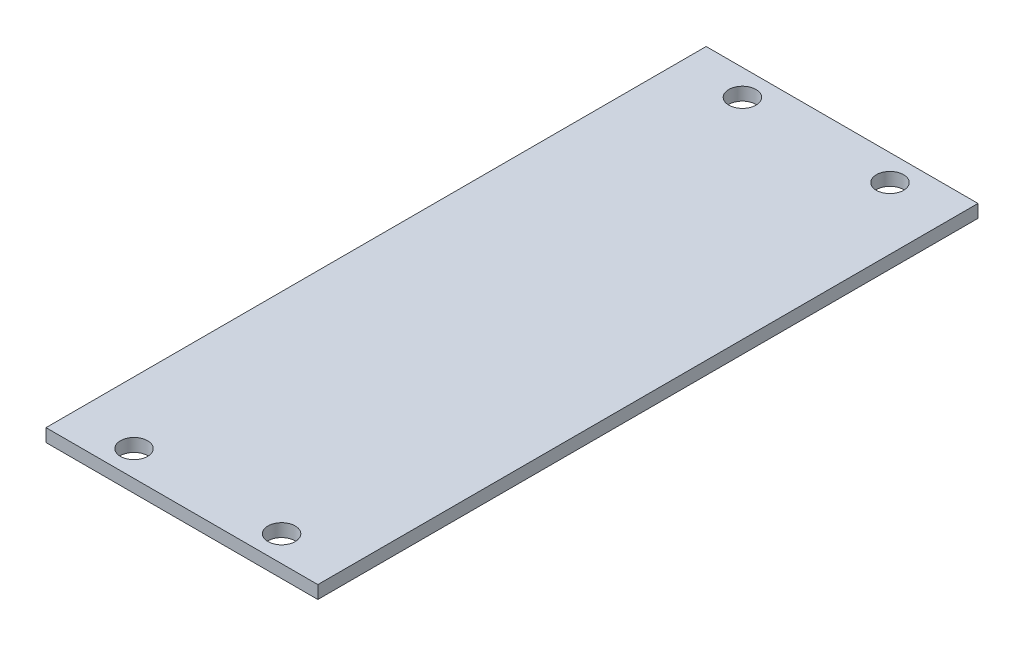
ISO-10303-21;
HEADER;
FILE_DESCRIPTION(('STEP AP214'),'2;1');
FILE_NAME('part.step','',(''),(''),'','','');
FILE_SCHEMA(('AUTOMOTIVE_DESIGN { 1 0 10303 214 1 1 1 1 }'));
ENDSEC;
DATA;
#1=APPLICATION_CONTEXT('core data for automotive mechanical design processes');
#2=APPLICATION_PROTOCOL_DEFINITION('international standard','automotive_design',2000,#1);
#3=PRODUCT_CONTEXT('',#1,'mechanical');
#4=PRODUCT('Part','Part','',(#3));
#5=PRODUCT_RELATED_PRODUCT_CATEGORY('part','',(#4));
#6=PRODUCT_DEFINITION_FORMATION('','',#4);
#7=PRODUCT_DEFINITION_CONTEXT('part definition',#1,'design');
#8=PRODUCT_DEFINITION('design','',#6,#7);
#9=PRODUCT_DEFINITION_SHAPE('','',#8);
#10=(LENGTH_UNIT() NAMED_UNIT(*) SI_UNIT(.MILLI.,.METRE.));
#11=(NAMED_UNIT(*) PLANE_ANGLE_UNIT() SI_UNIT($,.RADIAN.));
#12=(NAMED_UNIT(*) SI_UNIT($,.STERADIAN.) SOLID_ANGLE_UNIT());
#13=UNCERTAINTY_MEASURE_WITH_UNIT(LENGTH_MEASURE(1.E-05),#10,'distance_accuracy_value','');
#14=(GEOMETRIC_REPRESENTATION_CONTEXT(3) GLOBAL_UNCERTAINTY_ASSIGNED_CONTEXT((#13)) GLOBAL_UNIT_ASSIGNED_CONTEXT((#10,
#11,#12)) REPRESENTATION_CONTEXT('',''));
#15=CARTESIAN_POINT('',(0.,0.,0.));
#16=DIRECTION('',(0.,0.,1.));
#17=DIRECTION('',(1.,0.,0.));
#18=AXIS2_PLACEMENT_3D('',#15,#16,#17);
#19=CARTESIAN_POINT('',(10.5,1.,25.5));
#20=DIRECTION('',(-1.,0.,0.));
#21=DIRECTION('',(0.,0.,1.));
#22=AXIS2_PLACEMENT_3D('',#19,#20,#21);
#23=PLANE('',#22);
#24=DIRECTION('',(0.,0.,-1.));
#25=VECTOR('',#24,1.);
#26=CARTESIAN_POINT('',(10.5,0.,25.5));
#27=LINE('',#26,#25);
#28=CARTESIAN_POINT('',(10.5,0.,25.5));
#29=VERTEX_POINT('',#28);
#30=CARTESIAN_POINT('',(10.5,0.,-25.5));
#31=VERTEX_POINT('',#30);
#32=EDGE_CURVE('E111',#29,#31,#27,.T.);
#33=ORIENTED_EDGE('',*,*,#32,.T.);
#34=DIRECTION('',(0.,-1.,0.));
#35=VECTOR('',#34,1.);
#36=CARTESIAN_POINT('',(10.5,1.,-25.5));
#37=LINE('',#36,#35);
#38=CARTESIAN_POINT('',(10.5,1.,-25.5));
#39=VERTEX_POINT('',#38);
#40=EDGE_CURVE('E11',#39,#31,#37,.T.);
#41=ORIENTED_EDGE('',*,*,#40,.F.);
#42=DIRECTION('',(0.,0.,-1.));
#43=VECTOR('',#42,1.);
#44=CARTESIAN_POINT('',(10.5,1.,25.5));
#45=LINE('',#44,#43);
#46=CARTESIAN_POINT('',(10.5,1.,25.5));
#47=VERTEX_POINT('',#46);
#48=EDGE_CURVE('E95',#47,#39,#45,.T.);
#49=ORIENTED_EDGE('',*,*,#48,.F.);
#50=DIRECTION('',(0.,-1.,0.));
#51=VECTOR('',#50,1.);
#52=CARTESIAN_POINT('',(10.5,1.,25.5));
#53=LINE('',#52,#51);
#54=EDGE_CURVE('E107',#47,#29,#53,.T.);
#55=ORIENTED_EDGE('',*,*,#54,.T.);
#56=EDGE_LOOP('',(#33,#41,#49,#55));
#57=FACE_BOUND('',#56,.T.);
#58=ADVANCED_FACE('F43',(#57),#23,.F.);
#59=CARTESIAN_POINT('',(-10.5,1.,-25.5));
#60=DIRECTION('',(0.,0.,1.));
#61=DIRECTION('',(1.,0.,0.));
#62=AXIS2_PLACEMENT_3D('',#59,#60,#61);
#63=PLANE('',#62);
#64=DIRECTION('',(-1.,0.,0.));
#65=VECTOR('',#64,1.);
#66=CARTESIAN_POINT('',(-10.5,0.,-25.5));
#67=LINE('',#66,#65);
#68=CARTESIAN_POINT('',(-10.5,0.,-25.5));
#69=VERTEX_POINT('',#68);
#70=EDGE_CURVE('E100',#31,#69,#67,.T.);
#71=ORIENTED_EDGE('',*,*,#70,.T.);
#72=DIRECTION('',(0.,-1.,0.));
#73=VECTOR('',#72,1.);
#74=CARTESIAN_POINT('',(-10.5,1.,-25.5));
#75=LINE('',#74,#73);
#76=CARTESIAN_POINT('',(-10.5,1.,-25.5));
#77=VERTEX_POINT('',#76);
#78=EDGE_CURVE('E52',#77,#69,#75,.T.);
#79=ORIENTED_EDGE('',*,*,#78,.F.);
#80=DIRECTION('',(-1.,0.,0.));
#81=VECTOR('',#80,1.);
#82=CARTESIAN_POINT('',(-10.5,1.,-25.5));
#83=LINE('',#82,#81);
#84=EDGE_CURVE('E90',#39,#77,#83,.T.);
#85=ORIENTED_EDGE('',*,*,#84,.F.);
#86=ORIENTED_EDGE('',*,*,#40,.T.);
#87=EDGE_LOOP('',(#71,#79,#85,#86));
#88=FACE_BOUND('',#87,.T.);
#89=ADVANCED_FACE('F99',(#88),#63,.F.);
#90=CARTESIAN_POINT('',(-10.5,1.,25.5));
#91=DIRECTION('',(1.,0.,0.));
#92=DIRECTION('',(0.,0.,-1.));
#93=AXIS2_PLACEMENT_3D('',#90,#91,#92);
#94=PLANE('',#93);
#95=DIRECTION('',(0.,0.,1.));
#96=VECTOR('',#95,1.);
#97=CARTESIAN_POINT('',(-10.5,0.,25.5));
#98=LINE('',#97,#96);
#99=CARTESIAN_POINT('',(-10.5,0.,25.5));
#100=VERTEX_POINT('',#99);
#101=EDGE_CURVE('E77',#69,#100,#98,.T.);
#102=ORIENTED_EDGE('',*,*,#101,.T.);
#103=DIRECTION('',(0.,-1.,0.));
#104=VECTOR('',#103,1.);
#105=CARTESIAN_POINT('',(-10.5,1.,25.5));
#106=LINE('',#105,#104);
#107=CARTESIAN_POINT('',(-10.5,1.,25.5));
#108=VERTEX_POINT('',#107);
#109=EDGE_CURVE('E102',#108,#100,#106,.T.);
#110=ORIENTED_EDGE('',*,*,#109,.F.);
#111=DIRECTION('',(0.,0.,1.));
#112=VECTOR('',#111,1.);
#113=CARTESIAN_POINT('',(-10.5,1.,25.5));
#114=LINE('',#113,#112);
#115=EDGE_CURVE('E93',#77,#108,#114,.T.);
#116=ORIENTED_EDGE('',*,*,#115,.F.);
#117=ORIENTED_EDGE('',*,*,#78,.T.);
#118=EDGE_LOOP('',(#102,#110,#116,#117));
#119=FACE_BOUND('',#118,.T.);
#120=ADVANCED_FACE('F103',(#119),#94,.F.);
#121=CARTESIAN_POINT('',(-10.5,1.,25.5));
#122=DIRECTION('',(0.,0.,-1.));
#123=DIRECTION('',(-1.,0.,0.));
#124=AXIS2_PLACEMENT_3D('',#121,#122,#123);
#125=PLANE('',#124);
#126=DIRECTION('',(1.,0.,0.));
#127=VECTOR('',#126,1.);
#128=CARTESIAN_POINT('',(-10.5,0.,25.5));
#129=LINE('',#128,#127);
#130=EDGE_CURVE('E83',#100,#29,#129,.T.);
#131=ORIENTED_EDGE('',*,*,#130,.T.);
#132=ORIENTED_EDGE('',*,*,#54,.F.);
#133=DIRECTION('',(1.,0.,0.));
#134=VECTOR('',#133,1.);
#135=CARTESIAN_POINT('',(-10.5,1.,25.5));
#136=LINE('',#135,#134);
#137=EDGE_CURVE('E60',#108,#47,#136,.T.);
#138=ORIENTED_EDGE('',*,*,#137,.F.);
#139=ORIENTED_EDGE('',*,*,#109,.T.);
#140=EDGE_LOOP('',(#131,#132,#138,#139));
#141=FACE_BOUND('',#140,.T.);
#142=ADVANCED_FACE('F125',(#141),#125,.F.);
#143=CARTESIAN_POINT('',(0.,1.,0.));
#144=DIRECTION('',(0.,-1.,0.));
#145=DIRECTION('',(0.,0.,-1.));
#146=AXIS2_PLACEMENT_3D('',#143,#144,#145);
#147=PLANE('',#146);
#148=CARTESIAN_POINT('',(-5.7,1.,23.5));
#149=DIRECTION('',(0.,-1.,0.));
#150=DIRECTION('',(0.,0.,-1.));
#151=AXIS2_PLACEMENT_3D('',#148,#149,#150);
#152=CIRCLE('',#151,1.05);
#153=CARTESIAN_POINT('',(-5.7,1.,22.45));
#154=VERTEX_POINT('',#153);
#155=EDGE_CURVE('E156',#154,#154,#152,.T.);
#156=ORIENTED_EDGE('',*,*,#155,.T.);
#157=EDGE_LOOP('',(#156));
#158=FACE_BOUND('',#157,.T.);
#159=CARTESIAN_POINT('',(5.7,1.,23.5));
#160=DIRECTION('',(0.,1.,0.));
#161=DIRECTION('',(0.,0.,-1.));
#162=AXIS2_PLACEMENT_3D('',#159,#160,#161);
#163=CIRCLE('',#162,1.05);
#164=CARTESIAN_POINT('',(5.7,1.,22.45));
#165=VERTEX_POINT('',#164);
#166=EDGE_CURVE('E148',#165,#165,#163,.T.);
#167=ORIENTED_EDGE('',*,*,#166,.F.);
#168=EDGE_LOOP('',(#167));
#169=FACE_BOUND('',#168,.T.);
#170=CARTESIAN_POINT('',(5.7,1.,-23.5));
#171=DIRECTION('',(0.,-1.,0.));
#172=DIRECTION('',(0.,0.,1.));
#173=AXIS2_PLACEMENT_3D('',#170,#171,#172);
#174=CIRCLE('',#173,1.05);
#175=CARTESIAN_POINT('',(5.7,1.,-22.45));
#176=VERTEX_POINT('',#175);
#177=EDGE_CURVE('E140',#176,#176,#174,.T.);
#178=ORIENTED_EDGE('',*,*,#177,.T.);
#179=EDGE_LOOP('',(#178));
#180=FACE_BOUND('',#179,.T.);
#181=CARTESIAN_POINT('',(-5.7,1.,-23.5));
#182=DIRECTION('',(0.,1.,0.));
#183=DIRECTION('',(0.,0.,1.));
#184=AXIS2_PLACEMENT_3D('',#181,#182,#183);
#185=CIRCLE('',#184,1.05);
#186=CARTESIAN_POINT('',(-5.7,1.,-22.45));
#187=VERTEX_POINT('',#186);
#188=EDGE_CURVE('E132',#187,#187,#185,.T.);
#189=ORIENTED_EDGE('',*,*,#188,.F.);
#190=EDGE_LOOP('',(#189));
#191=FACE_BOUND('',#190,.T.);
#192=ORIENTED_EDGE('',*,*,#48,.T.);
#193=ORIENTED_EDGE('',*,*,#84,.T.);
#194=ORIENTED_EDGE('',*,*,#115,.T.);
#195=ORIENTED_EDGE('',*,*,#137,.T.);
#196=EDGE_LOOP('',(#192,#193,#194,#195));
#197=FACE_BOUND('',#196,.T.);
#198=ADVANCED_FACE('F91',(#158,#169,#180,#191,#197),#147,.F.);
#199=CARTESIAN_POINT('',(0.,0.,0.));
#200=DIRECTION('',(0.,-1.,0.));
#201=DIRECTION('',(0.,0.,-1.));
#202=AXIS2_PLACEMENT_3D('',#199,#200,#201);
#203=PLANE('',#202);
#204=CARTESIAN_POINT('',(-5.7,0.,23.5));
#205=DIRECTION('',(0.,-1.,0.));
#206=DIRECTION('',(0.,0.,-1.));
#207=AXIS2_PLACEMENT_3D('',#204,#205,#206);
#208=CIRCLE('',#207,1.05);
#209=CARTESIAN_POINT('',(-5.7,0.,22.45));
#210=VERTEX_POINT('',#209);
#211=EDGE_CURVE('E152',#210,#210,#208,.T.);
#212=ORIENTED_EDGE('',*,*,#211,.F.);
#213=EDGE_LOOP('',(#212));
#214=FACE_BOUND('',#213,.T.);
#215=CARTESIAN_POINT('',(5.7,0.,23.5));
#216=DIRECTION('',(0.,1.,0.));
#217=DIRECTION('',(0.,0.,-1.));
#218=AXIS2_PLACEMENT_3D('',#215,#216,#217);
#219=CIRCLE('',#218,1.05);
#220=CARTESIAN_POINT('',(5.7,0.,22.45));
#221=VERTEX_POINT('',#220);
#222=EDGE_CURVE('E144',#221,#221,#219,.T.);
#223=ORIENTED_EDGE('',*,*,#222,.T.);
#224=EDGE_LOOP('',(#223));
#225=FACE_BOUND('',#224,.T.);
#226=CARTESIAN_POINT('',(5.7,0.,-23.5));
#227=DIRECTION('',(0.,-1.,0.));
#228=DIRECTION('',(0.,0.,1.));
#229=AXIS2_PLACEMENT_3D('',#226,#227,#228);
#230=CIRCLE('',#229,1.05);
#231=CARTESIAN_POINT('',(5.7,0.,-22.45));
#232=VERTEX_POINT('',#231);
#233=EDGE_CURVE('E136',#232,#232,#230,.T.);
#234=ORIENTED_EDGE('',*,*,#233,.F.);
#235=EDGE_LOOP('',(#234));
#236=FACE_BOUND('',#235,.T.);
#237=CARTESIAN_POINT('',(-5.7,0.,-23.5));
#238=DIRECTION('',(0.,1.,0.));
#239=DIRECTION('',(0.,0.,1.));
#240=AXIS2_PLACEMENT_3D('',#237,#238,#239);
#241=CIRCLE('',#240,1.05);
#242=CARTESIAN_POINT('',(-5.7,0.,-22.45));
#243=VERTEX_POINT('',#242);
#244=EDGE_CURVE('E115',#243,#243,#241,.T.);
#245=ORIENTED_EDGE('',*,*,#244,.T.);
#246=EDGE_LOOP('',(#245));
#247=FACE_BOUND('',#246,.T.);
#248=ORIENTED_EDGE('',*,*,#32,.F.);
#249=ORIENTED_EDGE('',*,*,#130,.F.);
#250=ORIENTED_EDGE('',*,*,#101,.F.);
#251=ORIENTED_EDGE('',*,*,#70,.F.);
#252=EDGE_LOOP('',(#248,#249,#250,#251));
#253=FACE_BOUND('',#252,.T.);
#254=ADVANCED_FACE('F128',(#214,#225,#236,#247,#253),#203,.T.);
#255=CARTESIAN_POINT('',(-5.7,0.,-23.5));
#256=DIRECTION('',(0.,1.,0.));
#257=DIRECTION('',(0.,0.,1.));
#258=AXIS2_PLACEMENT_3D('',#255,#256,#257);
#259=CYLINDRICAL_SURFACE('',#258,1.05);
#260=ORIENTED_EDGE('',*,*,#244,.F.);
#261=EDGE_LOOP('',(#260));
#262=FACE_BOUND('',#261,.T.);
#263=ORIENTED_EDGE('',*,*,#188,.T.);
#264=EDGE_LOOP('',(#263));
#265=FACE_BOUND('',#264,.T.);
#266=ADVANCED_FACE('F169',(#262,#265),#259,.F.);
#267=CARTESIAN_POINT('',(5.7,0.,-23.5));
#268=DIRECTION('',(0.,1.,0.));
#269=DIRECTION('',(0.,0.,1.));
#270=AXIS2_PLACEMENT_3D('',#267,#268,#269);
#271=CYLINDRICAL_SURFACE('',#270,1.05);
#272=ORIENTED_EDGE('',*,*,#233,.T.);
#273=EDGE_LOOP('',(#272));
#274=FACE_BOUND('',#273,.T.);
#275=ORIENTED_EDGE('',*,*,#177,.F.);
#276=EDGE_LOOP('',(#275));
#277=FACE_BOUND('',#276,.T.);
#278=ADVANCED_FACE('F179',(#274,#277),#271,.F.);
#279=CARTESIAN_POINT('',(5.7,0.,23.5));
#280=DIRECTION('',(0.,1.,0.));
#281=DIRECTION('',(0.,0.,1.));
#282=AXIS2_PLACEMENT_3D('',#279,#280,#281);
#283=CYLINDRICAL_SURFACE('',#282,1.05);
#284=ORIENTED_EDGE('',*,*,#222,.F.);
#285=EDGE_LOOP('',(#284));
#286=FACE_BOUND('',#285,.T.);
#287=ORIENTED_EDGE('',*,*,#166,.T.);
#288=EDGE_LOOP('',(#287));
#289=FACE_BOUND('',#288,.T.);
#290=ADVANCED_FACE('F223',(#286,#289),#283,.F.);
#291=CARTESIAN_POINT('',(-5.7,0.,23.5));
#292=DIRECTION('',(0.,1.,0.));
#293=DIRECTION('',(0.,0.,1.));
#294=AXIS2_PLACEMENT_3D('',#291,#292,#293);
#295=CYLINDRICAL_SURFACE('',#294,1.05);
#296=ORIENTED_EDGE('',*,*,#211,.T.);
#297=EDGE_LOOP('',(#296));
#298=FACE_BOUND('',#297,.T.);
#299=ORIENTED_EDGE('',*,*,#155,.F.);
#300=EDGE_LOOP('',(#299));
#301=FACE_BOUND('',#300,.T.);
#302=ADVANCED_FACE('F164',(#298,#301),#295,.F.);
#303=CLOSED_SHELL('',(#58,#89,#120,#142,#198,#254,#266,#278,#290,#302));
#304=MANIFOLD_SOLID_BREP('B2',#303);
#305=ADVANCED_BREP_SHAPE_REPRESENTATION('',(#18,#304),#14);
#306=SHAPE_DEFINITION_REPRESENTATION(#9,#305);
ENDSEC;
END-ISO-10303-21;
